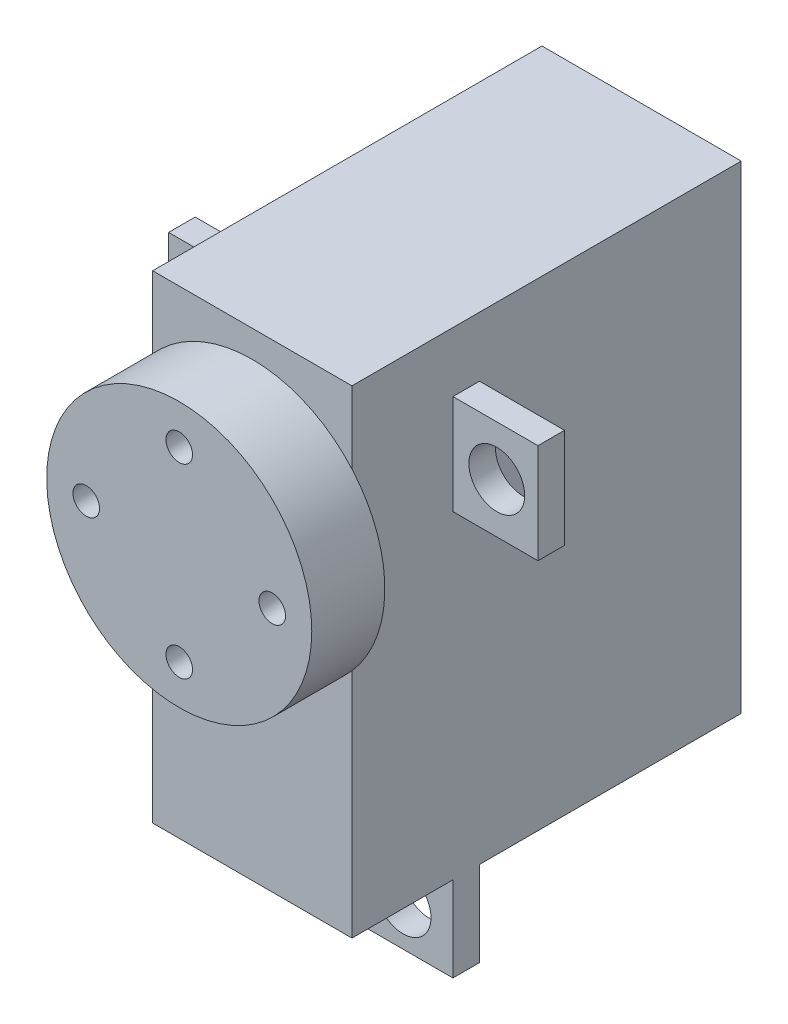
ISO-10303-21;
HEADER;
FILE_DESCRIPTION(('STEP AP214'),'2;1');
FILE_NAME('part.step','',(''),(''),'','','');
FILE_SCHEMA(('AUTOMOTIVE_DESIGN { 1 0 10303 214 1 1 1 1 }'));
ENDSEC;
DATA;
#1=APPLICATION_CONTEXT('core data for automotive mechanical design processes');
#2=APPLICATION_PROTOCOL_DEFINITION('international standard','automotive_design',2000,#1);
#3=PRODUCT_CONTEXT('',#1,'mechanical');
#4=PRODUCT('Part','Part','',(#3));
#5=PRODUCT_RELATED_PRODUCT_CATEGORY('part','',(#4));
#6=PRODUCT_DEFINITION_FORMATION('','',#4);
#7=PRODUCT_DEFINITION_CONTEXT('part definition',#1,'design');
#8=PRODUCT_DEFINITION('design','',#6,#7);
#9=PRODUCT_DEFINITION_SHAPE('','',#8);
#10=(LENGTH_UNIT() NAMED_UNIT(*) SI_UNIT(.MILLI.,.METRE.));
#11=(NAMED_UNIT(*) PLANE_ANGLE_UNIT() SI_UNIT($,.RADIAN.));
#12=(NAMED_UNIT(*) SI_UNIT($,.STERADIAN.) SOLID_ANGLE_UNIT());
#13=UNCERTAINTY_MEASURE_WITH_UNIT(LENGTH_MEASURE(1.E-05),#10,'distance_accuracy_value','');
#14=(GEOMETRIC_REPRESENTATION_CONTEXT(3) GLOBAL_UNCERTAINTY_ASSIGNED_CONTEXT((#13)) GLOBAL_UNIT_ASSIGNED_CONTEXT((#10,
#11,#12)) REPRESENTATION_CONTEXT('',''));
#15=CARTESIAN_POINT('',(0.,0.,0.));
#16=DIRECTION('',(0.,0.,1.));
#17=DIRECTION('',(1.,0.,0.));
#18=AXIS2_PLACEMENT_3D('',#15,#16,#17);
#19=CARTESIAN_POINT('',(-7.5,-18.,29.3));
#20=DIRECTION('',(0.,1.,0.));
#21=DIRECTION('',(0.,0.,1.));
#22=AXIS2_PLACEMENT_3D('',#19,#20,#21);
#23=PLANE('',#22);
#24=DIRECTION('',(0.,0.,-1.));
#25=VECTOR('',#24,1.);
#26=CARTESIAN_POINT('',(-3.,-18.,0.));
#27=LINE('',#26,#25);
#28=CARTESIAN_POINT('',(-3.,-18.,5.));
#29=VERTEX_POINT('',#28);
#30=CARTESIAN_POINT('',(-3.,-18.,0.));
#31=VERTEX_POINT('',#30);
#32=EDGE_CURVE('E58',#29,#31,#27,.T.);
#33=ORIENTED_EDGE('',*,*,#32,.F.);
#34=DIRECTION('',(-1.,0.,0.));
#35=VECTOR('',#34,1.);
#36=CARTESIAN_POINT('',(-3.,-18.,5.));
#37=LINE('',#36,#35);
#38=CARTESIAN_POINT('',(3.,-18.,5.));
#39=VERTEX_POINT('',#38);
#40=EDGE_CURVE('E62',#39,#29,#37,.T.);
#41=ORIENTED_EDGE('',*,*,#40,.F.);
#42=DIRECTION('',(0.,0.,1.));
#43=VECTOR('',#42,1.);
#44=CARTESIAN_POINT('',(3.,-18.,0.));
#45=LINE('',#44,#43);
#46=CARTESIAN_POINT('',(3.,-18.,0.));
#47=VERTEX_POINT('',#46);
#48=EDGE_CURVE('E716',#47,#39,#45,.T.);
#49=ORIENTED_EDGE('',*,*,#48,.F.);
#50=DIRECTION('',(1.,0.,0.));
#51=VECTOR('',#50,1.);
#52=CARTESIAN_POINT('',(-7.5,-18.,0.));
#53=LINE('',#52,#51);
#54=CARTESIAN_POINT('',(7.5,-18.,0.));
#55=VERTEX_POINT('',#54);
#56=EDGE_CURVE('E399',#47,#55,#53,.T.);
#57=ORIENTED_EDGE('',*,*,#56,.T.);
#58=DIRECTION('',(0.,0.,-1.));
#59=VECTOR('',#58,1.);
#60=CARTESIAN_POINT('',(7.5,-18.,29.3));
#61=LINE('',#60,#59);
#62=CARTESIAN_POINT('',(7.5,-18.,19.7));
#63=VERTEX_POINT('',#62);
#64=EDGE_CURVE('E391',#63,#55,#61,.T.);
#65=ORIENTED_EDGE('',*,*,#64,.F.);
#66=DIRECTION('',(1.,0.,0.));
#67=VECTOR('',#66,1.);
#68=CARTESIAN_POINT('',(7.5,-18.,19.7));
#69=LINE('',#68,#67);
#70=CARTESIAN_POINT('',(-7.5,-18.,19.7));
#71=VERTEX_POINT('',#70);
#72=EDGE_CURVE('E325',#71,#63,#69,.T.);
#73=ORIENTED_EDGE('',*,*,#72,.F.);
#74=DIRECTION('',(0.,0.,-1.));
#75=VECTOR('',#74,1.);
#76=CARTESIAN_POINT('',(-7.5,-18.,29.3));
#77=LINE('',#76,#75);
#78=CARTESIAN_POINT('',(-7.5,-18.,0.));
#79=VERTEX_POINT('',#78);
#80=EDGE_CURVE('E405',#71,#79,#77,.T.);
#81=ORIENTED_EDGE('',*,*,#80,.T.);
#82=EDGE_CURVE('E400',#79,#31,#53,.T.);
#83=ORIENTED_EDGE('',*,*,#82,.T.);
#84=EDGE_LOOP('',(#33,#41,#49,#57,#65,#73,#81,#83));
#85=FACE_BOUND('',#84,.T.);
#86=ADVANCED_FACE('F39',(#85),#23,.F.);
#87=CARTESIAN_POINT('',(-7.5,18.,29.3));
#88=DIRECTION('',(1.,0.,0.));
#89=DIRECTION('',(0.,1.,0.));
#90=AXIS2_PLACEMENT_3D('',#87,#88,#89);
#91=PLANE('',#90);
#92=DIRECTION('',(0.,-1.,0.));
#93=VECTOR('',#92,1.);
#94=CARTESIAN_POINT('',(-7.5,18.,0.));
#95=LINE('',#94,#93);
#96=CARTESIAN_POINT('',(-7.5,18.,0.));
#97=VERTEX_POINT('',#96);
#98=EDGE_CURVE('E396',#97,#79,#95,.T.);
#99=ORIENTED_EDGE('',*,*,#98,.T.);
#100=ORIENTED_EDGE('',*,*,#80,.F.);
#101=DIRECTION('',(0.,1.,0.));
#102=VECTOR('',#101,1.);
#103=CARTESIAN_POINT('',(-7.5,-18.,19.7));
#104=LINE('',#103,#102);
#105=CARTESIAN_POINT('',(-7.5,-24.4,19.7));
#106=VERTEX_POINT('',#105);
#107=EDGE_CURVE('E339',#106,#71,#104,.T.);
#108=ORIENTED_EDGE('',*,*,#107,.F.);
#109=DIRECTION('',(0.,0.,-1.));
#110=VECTOR('',#109,1.);
#111=CARTESIAN_POINT('',(-7.5,-24.4,21.7));
#112=LINE('',#111,#110);
#113=CARTESIAN_POINT('',(-7.5,-24.4,21.7));
#114=VERTEX_POINT('',#113);
#115=EDGE_CURVE('E343',#114,#106,#112,.T.);
#116=ORIENTED_EDGE('',*,*,#115,.F.);
#117=DIRECTION('',(0.,1.,0.));
#118=VECTOR('',#117,1.);
#119=CARTESIAN_POINT('',(-7.5,-18.,21.7));
#120=LINE('',#119,#118);
#121=CARTESIAN_POINT('',(-7.5,-18.,21.7));
#122=VERTEX_POINT('',#121);
#123=EDGE_CURVE('E328',#114,#122,#120,.T.);
#124=ORIENTED_EDGE('',*,*,#123,.T.);
#125=CARTESIAN_POINT('',(-7.5,-18.,29.3));
#126=VERTEX_POINT('',#125);
#127=EDGE_CURVE('E406',#126,#122,#77,.T.);
#128=ORIENTED_EDGE('',*,*,#127,.F.);
#129=DIRECTION('',(0.,-1.,0.));
#130=VECTOR('',#129,1.);
#131=CARTESIAN_POINT('',(-7.5,18.,29.3));
#132=LINE('',#131,#130);
#133=CARTESIAN_POINT('',(-7.5,-0.576520736681362,29.3));
#134=VERTEX_POINT('',#133);
#135=EDGE_CURVE('E384',#134,#126,#132,.T.);
#136=ORIENTED_EDGE('',*,*,#135,.F.);
#137=CARTESIAN_POINT('',(-7.5,5.13397459621556,29.3));
#138=VERTEX_POINT('',#137);
#139=EDGE_CURVE('E431',#138,#134,#132,.T.);
#140=ORIENTED_EDGE('',*,*,#139,.F.);
#141=CARTESIAN_POINT('',(-7.5,6.86602540378444,29.3));
#142=VERTEX_POINT('',#141);
#143=EDGE_CURVE('E423',#142,#138,#132,.T.);
#144=ORIENTED_EDGE('',*,*,#143,.F.);
#145=CARTESIAN_POINT('',(-7.5,12.5765207366814,29.3));
#146=VERTEX_POINT('',#145);
#147=EDGE_CURVE('E389',#146,#142,#132,.T.);
#148=ORIENTED_EDGE('',*,*,#147,.F.);
#149=CARTESIAN_POINT('',(-7.5,18.,29.3));
#150=VERTEX_POINT('',#149);
#151=EDGE_CURVE('E385',#150,#146,#132,.T.);
#152=ORIENTED_EDGE('',*,*,#151,.F.);
#153=DIRECTION('',(0.,0.,-1.));
#154=VECTOR('',#153,1.);
#155=CARTESIAN_POINT('',(-7.5,18.,29.3));
#156=LINE('',#155,#154);
#157=EDGE_CURVE('E408',#150,#97,#156,.T.);
#158=ORIENTED_EDGE('',*,*,#157,.T.);
#159=EDGE_LOOP('',(#99,#100,#108,#116,#124,#128,#136,#140,#144,#148,#152,#158));
#160=FACE_BOUND('',#159,.T.);
#161=DIRECTION('',(0.,-1.,0.));
#162=VECTOR('',#161,1.);
#163=CARTESIAN_POINT('',(-7.5,13.5,21.7));
#164=LINE('',#163,#162);
#165=CARTESIAN_POINT('',(-7.5,13.5,21.7));
#166=VERTEX_POINT('',#165);
#167=CARTESIAN_POINT('',(-7.5,6.00000000000001,21.7));
#168=VERTEX_POINT('',#167);
#169=EDGE_CURVE('E245',#166,#168,#164,.T.);
#170=ORIENTED_EDGE('',*,*,#169,.T.);
#171=DIRECTION('',(0.,0.,-1.));
#172=VECTOR('',#171,1.);
#173=CARTESIAN_POINT('',(-7.5,6.00000000000001,21.7));
#174=LINE('',#173,#172);
#175=CARTESIAN_POINT('',(-7.5,6.00000000000001,19.7));
#176=VERTEX_POINT('',#175);
#177=EDGE_CURVE('E235',#168,#176,#174,.T.);
#178=ORIENTED_EDGE('',*,*,#177,.T.);
#179=DIRECTION('',(0.,-1.,0.));
#180=VECTOR('',#179,1.);
#181=CARTESIAN_POINT('',(-7.5,13.5,19.7));
#182=LINE('',#181,#180);
#183=CARTESIAN_POINT('',(-7.5,13.5,19.7));
#184=VERTEX_POINT('',#183);
#185=EDGE_CURVE('E251',#184,#176,#182,.T.);
#186=ORIENTED_EDGE('',*,*,#185,.F.);
#187=DIRECTION('',(0.,0.,-1.));
#188=VECTOR('',#187,1.);
#189=CARTESIAN_POINT('',(-7.5,13.5,21.7));
#190=LINE('',#189,#188);
#191=EDGE_CURVE('E226',#166,#184,#190,.T.);
#192=ORIENTED_EDGE('',*,*,#191,.F.);
#193=EDGE_LOOP('',(#170,#178,#186,#192));
#194=FACE_BOUND('',#193,.T.);
#195=ADVANCED_FACE('F427',(#160,#194),#91,.F.);
#196=CARTESIAN_POINT('',(0.,0.,29.3));
#197=DIRECTION('',(0.,0.,1.));
#198=DIRECTION('',(1.,0.,0.));
#199=AXIS2_PLACEMENT_3D('',#196,#197,#198);
#200=PLANE('',#199);
#201=CARTESIAN_POINT('',(0.,6.,29.3));
#202=DIRECTION('',(0.,0.,1.));
#203=DIRECTION('',(1.,0.,0.));
#204=AXIS2_PLACEMENT_3D('',#201,#202,#203);
#205=CIRCLE('',#204,9.975);
#206=CARTESIAN_POINT('',(7.5,12.5765207366814,29.3));
#207=VERTEX_POINT('',#206);
#208=EDGE_CURVE('E50',#207,#146,#205,.T.);
#209=ORIENTED_EDGE('',*,*,#208,.F.);
#210=DIRECTION('',(0.,1.,0.));
#211=VECTOR('',#210,1.);
#212=CARTESIAN_POINT('',(7.5,18.,29.3));
#213=LINE('',#212,#211);
#214=CARTESIAN_POINT('',(7.5,18.,29.3));
#215=VERTEX_POINT('',#214);
#216=EDGE_CURVE('E382',#207,#215,#213,.T.);
#217=ORIENTED_EDGE('',*,*,#216,.T.);
#218=DIRECTION('',(-1.,0.,0.));
#219=VECTOR('',#218,1.);
#220=CARTESIAN_POINT('',(-7.5,18.,29.3));
#221=LINE('',#220,#219);
#222=EDGE_CURVE('E380',#215,#150,#221,.T.);
#223=ORIENTED_EDGE('',*,*,#222,.T.);
#224=ORIENTED_EDGE('',*,*,#151,.T.);
#225=EDGE_LOOP('',(#209,#217,#223,#224));
#226=FACE_BOUND('',#225,.T.);
#227=ADVANCED_FACE('F459',(#226),#200,.T.);
#228=CARTESIAN_POINT('',(7.5,5.13397459621556,29.3));
#229=VERTEX_POINT('',#228);
#230=CARTESIAN_POINT('',(7.5,6.86602540378444,29.3));
#231=VERTEX_POINT('',#230);
#232=EDGE_CURVE('E450',#229,#231,#213,.T.);
#233=ORIENTED_EDGE('',*,*,#232,.T.);
#234=CARTESIAN_POINT('',(7.,6.,29.3));
#235=DIRECTION('',(0.,0.,1.));
#236=DIRECTION('',(1.,0.,0.));
#237=AXIS2_PLACEMENT_3D('',#234,#235,#236);
#238=CIRCLE('',#237,1.);
#239=EDGE_CURVE('E363',#231,#229,#238,.T.);
#240=ORIENTED_EDGE('',*,*,#239,.T.);
#241=EDGE_LOOP('',(#233,#240));
#242=FACE_BOUND('',#241,.T.);
#243=ADVANCED_FACE('F511',(#242),#200,.T.);
#244=ORIENTED_EDGE('',*,*,#143,.T.);
#245=CARTESIAN_POINT('',(-7.,6.,29.3));
#246=DIRECTION('',(0.,0.,1.));
#247=DIRECTION('',(1.,0.,0.));
#248=AXIS2_PLACEMENT_3D('',#245,#246,#247);
#249=CIRCLE('',#248,1.);
#250=EDGE_CURVE('E48',#138,#142,#249,.T.);
#251=ORIENTED_EDGE('',*,*,#250,.T.);
#252=EDGE_LOOP('',(#244,#251));
#253=FACE_BOUND('',#252,.T.);
#254=ADVANCED_FACE('F422',(#253),#200,.T.);
#255=CARTESIAN_POINT('',(7.5,18.,29.3));
#256=DIRECTION('',(-1.,0.,0.));
#257=DIRECTION('',(0.,-1.,0.));
#258=AXIS2_PLACEMENT_3D('',#255,#256,#257);
#259=PLANE('',#258);
#260=DIRECTION('',(0.,0.,-1.));
#261=VECTOR('',#260,1.);
#262=CARTESIAN_POINT('',(7.5,6.,21.7));
#263=LINE('',#262,#261);
#264=CARTESIAN_POINT('',(7.5,6.,21.7));
#265=VERTEX_POINT('',#264);
#266=CARTESIAN_POINT('',(7.5,6.,19.7));
#267=VERTEX_POINT('',#266);
#268=EDGE_CURVE('E268',#265,#267,#263,.T.);
#269=ORIENTED_EDGE('',*,*,#268,.F.);
#270=DIRECTION('',(0.,1.,0.));
#271=VECTOR('',#270,1.);
#272=CARTESIAN_POINT('',(7.5,13.5,21.7));
#273=LINE('',#272,#271);
#274=CARTESIAN_POINT('',(7.5,13.5,21.7));
#275=VERTEX_POINT('',#274);
#276=EDGE_CURVE('E284',#265,#275,#273,.T.);
#277=ORIENTED_EDGE('',*,*,#276,.T.);
#278=DIRECTION('',(0.,0.,-1.));
#279=VECTOR('',#278,1.);
#280=CARTESIAN_POINT('',(7.5,13.5,21.7));
#281=LINE('',#280,#279);
#282=CARTESIAN_POINT('',(7.5,13.5,19.7));
#283=VERTEX_POINT('',#282);
#284=EDGE_CURVE('E271',#275,#283,#281,.T.);
#285=ORIENTED_EDGE('',*,*,#284,.T.);
#286=DIRECTION('',(0.,1.,0.));
#287=VECTOR('',#286,1.);
#288=CARTESIAN_POINT('',(7.5,13.5,19.7));
#289=LINE('',#288,#287);
#290=EDGE_CURVE('E290',#267,#283,#289,.T.);
#291=ORIENTED_EDGE('',*,*,#290,.F.);
#292=EDGE_LOOP('',(#269,#277,#285,#291));
#293=FACE_BOUND('',#292,.T.);
#294=DIRECTION('',(0.,1.,0.));
#295=VECTOR('',#294,1.);
#296=CARTESIAN_POINT('',(7.5,18.,0.));
#297=LINE('',#296,#295);
#298=CARTESIAN_POINT('',(7.5,18.,0.));
#299=VERTEX_POINT('',#298);
#300=EDGE_CURVE('E374',#55,#299,#297,.T.);
#301=ORIENTED_EDGE('',*,*,#300,.T.);
#302=DIRECTION('',(0.,0.,-1.));
#303=VECTOR('',#302,1.);
#304=CARTESIAN_POINT('',(7.5,18.,29.3));
#305=LINE('',#304,#303);
#306=EDGE_CURVE('E43',#215,#299,#305,.T.);
#307=ORIENTED_EDGE('',*,*,#306,.F.);
#308=ORIENTED_EDGE('',*,*,#216,.F.);
#309=EDGE_CURVE('E453',#231,#207,#213,.T.);
#310=ORIENTED_EDGE('',*,*,#309,.F.);
#311=ORIENTED_EDGE('',*,*,#232,.F.);
#312=CARTESIAN_POINT('',(7.5,-0.576520736681362,29.3));
#313=VERTEX_POINT('',#312);
#314=EDGE_CURVE('E381',#313,#229,#213,.T.);
#315=ORIENTED_EDGE('',*,*,#314,.F.);
#316=CARTESIAN_POINT('',(7.5,-18.,29.3));
#317=VERTEX_POINT('',#316);
#318=EDGE_CURVE('E377',#317,#313,#213,.T.);
#319=ORIENTED_EDGE('',*,*,#318,.F.);
#320=CARTESIAN_POINT('',(7.5,-18.,21.7));
#321=VERTEX_POINT('',#320);
#322=EDGE_CURVE('E402',#317,#321,#61,.T.);
#323=ORIENTED_EDGE('',*,*,#322,.T.);
#324=DIRECTION('',(0.,-1.,0.));
#325=VECTOR('',#324,1.);
#326=CARTESIAN_POINT('',(7.5,-18.,21.7));
#327=LINE('',#326,#325);
#328=CARTESIAN_POINT('',(7.5,-24.4,21.7));
#329=VERTEX_POINT('',#328);
#330=EDGE_CURVE('E321',#321,#329,#327,.T.);
#331=ORIENTED_EDGE('',*,*,#330,.T.);
#332=DIRECTION('',(0.,0.,-1.));
#333=VECTOR('',#332,1.);
#334=CARTESIAN_POINT('',(7.5,-24.4,21.7));
#335=LINE('',#334,#333);
#336=CARTESIAN_POINT('',(7.5,-24.4,19.7));
#337=VERTEX_POINT('',#336);
#338=EDGE_CURVE('E333',#329,#337,#335,.T.);
#339=ORIENTED_EDGE('',*,*,#338,.T.);
#340=DIRECTION('',(0.,-1.,0.));
#341=VECTOR('',#340,1.);
#342=CARTESIAN_POINT('',(7.5,-18.,19.7));
#343=LINE('',#342,#341);
#344=EDGE_CURVE('E318',#63,#337,#343,.T.);
#345=ORIENTED_EDGE('',*,*,#344,.F.);
#346=ORIENTED_EDGE('',*,*,#64,.T.);
#347=EDGE_LOOP('',(#301,#307,#308,#310,#311,#315,#319,#323,#331,#339,#345,#346));
#348=FACE_BOUND('',#347,.T.);
#349=ADVANCED_FACE('F41',(#293,#348),#259,.F.);
#350=CARTESIAN_POINT('',(-7.5,18.,29.3));
#351=DIRECTION('',(0.,-1.,0.));
#352=DIRECTION('',(0.,0.,-1.));
#353=AXIS2_PLACEMENT_3D('',#350,#351,#352);
#354=PLANE('',#353);
#355=DIRECTION('',(-1.,0.,0.));
#356=VECTOR('',#355,1.);
#357=CARTESIAN_POINT('',(-7.5,18.,0.));
#358=LINE('',#357,#356);
#359=EDGE_CURVE('E394',#299,#97,#358,.T.);
#360=ORIENTED_EDGE('',*,*,#359,.T.);
#361=ORIENTED_EDGE('',*,*,#157,.F.);
#362=ORIENTED_EDGE('',*,*,#222,.F.);
#363=ORIENTED_EDGE('',*,*,#306,.T.);
#364=EDGE_LOOP('',(#360,#361,#362,#363));
#365=FACE_BOUND('',#364,.T.);
#366=ADVANCED_FACE('F460',(#365),#354,.F.);
#367=ORIENTED_EDGE('',*,*,#127,.T.);
#368=DIRECTION('',(1.,0.,0.));
#369=VECTOR('',#368,1.);
#370=CARTESIAN_POINT('',(7.5,-18.,21.7));
#371=LINE('',#370,#369);
#372=EDGE_CURVE('E330',#122,#321,#371,.T.);
#373=ORIENTED_EDGE('',*,*,#372,.T.);
#374=ORIENTED_EDGE('',*,*,#322,.F.);
#375=DIRECTION('',(1.,0.,0.));
#376=VECTOR('',#375,1.);
#377=CARTESIAN_POINT('',(-7.5,-18.,29.3));
#378=LINE('',#377,#376);
#379=EDGE_CURVE('E388',#126,#317,#378,.T.);
#380=ORIENTED_EDGE('',*,*,#379,.F.);
#381=EDGE_LOOP('',(#367,#373,#374,#380));
#382=FACE_BOUND('',#381,.T.);
#383=ADVANCED_FACE('F443',(#382),#23,.F.);
#384=EDGE_CURVE('E11',#134,#313,#205,.T.);
#385=ORIENTED_EDGE('',*,*,#384,.F.);
#386=ORIENTED_EDGE('',*,*,#135,.T.);
#387=ORIENTED_EDGE('',*,*,#379,.T.);
#388=ORIENTED_EDGE('',*,*,#318,.T.);
#389=EDGE_LOOP('',(#385,#386,#387,#388));
#390=FACE_BOUND('',#389,.T.);
#391=ADVANCED_FACE('F437',(#390),#200,.T.);
#392=CARTESIAN_POINT('',(0.,0.,0.));
#393=DIRECTION('',(0.,0.,1.));
#394=DIRECTION('',(1.,0.,0.));
#395=AXIS2_PLACEMENT_3D('',#392,#393,#394);
#396=PLANE('',#395);
#397=ORIENTED_EDGE('',*,*,#300,.F.);
#398=ORIENTED_EDGE('',*,*,#56,.F.);
#399=DIRECTION('',(0.,1.,0.));
#400=VECTOR('',#399,1.);
#401=CARTESIAN_POINT('',(3.,-22.,0.));
#402=LINE('',#401,#400);
#403=CARTESIAN_POINT('',(3.,-22.,0.));
#404=VERTEX_POINT('',#403);
#405=EDGE_CURVE('E211',#404,#47,#402,.T.);
#406=ORIENTED_EDGE('',*,*,#405,.F.);
#407=DIRECTION('',(1.,0.,0.));
#408=VECTOR('',#407,1.);
#409=CARTESIAN_POINT('',(-3.,-22.,0.));
#410=LINE('',#409,#408);
#411=CARTESIAN_POINT('',(-3.,-22.,0.));
#412=VERTEX_POINT('',#411);
#413=EDGE_CURVE('E203',#412,#404,#410,.T.);
#414=ORIENTED_EDGE('',*,*,#413,.F.);
#415=DIRECTION('',(0.,1.,0.));
#416=VECTOR('',#415,1.);
#417=CARTESIAN_POINT('',(-3.,-22.,0.));
#418=LINE('',#417,#416);
#419=EDGE_CURVE('E209',#412,#31,#418,.T.);
#420=ORIENTED_EDGE('',*,*,#419,.T.);
#421=ORIENTED_EDGE('',*,*,#82,.F.);
#422=ORIENTED_EDGE('',*,*,#98,.F.);
#423=ORIENTED_EDGE('',*,*,#359,.F.);
#424=EDGE_LOOP('',(#397,#398,#406,#414,#420,#421,#422,#423));
#425=FACE_BOUND('',#424,.T.);
#426=ADVANCED_FACE('F206',(#425),#396,.F.);
#427=CARTESIAN_POINT('',(0.,6.,29.3));
#428=DIRECTION('',(0.,0.,1.));
#429=DIRECTION('',(1.,0.,0.));
#430=AXIS2_PLACEMENT_3D('',#427,#428,#429);
#431=PLANE('',#430);
#432=EDGE_CURVE('E369',#313,#207,#205,.T.);
#433=ORIENTED_EDGE('',*,*,#432,.F.);
#434=ORIENTED_EDGE('',*,*,#314,.T.);
#435=EDGE_CURVE('E356',#229,#231,#238,.T.);
#436=ORIENTED_EDGE('',*,*,#435,.T.);
#437=ORIENTED_EDGE('',*,*,#309,.T.);
#438=EDGE_LOOP('',(#433,#434,#436,#437));
#439=FACE_BOUND('',#438,.T.);
#440=ADVANCED_FACE('F672',(#439),#431,.F.);
#441=EDGE_CURVE('E51',#146,#134,#205,.T.);
#442=ORIENTED_EDGE('',*,*,#441,.F.);
#443=ORIENTED_EDGE('',*,*,#147,.T.);
#444=EDGE_CURVE('E345',#142,#138,#249,.T.);
#445=ORIENTED_EDGE('',*,*,#444,.T.);
#446=ORIENTED_EDGE('',*,*,#139,.T.);
#447=EDGE_LOOP('',(#442,#443,#445,#446));
#448=FACE_BOUND('',#447,.T.);
#449=ADVANCED_FACE('F763',(#448),#431,.F.);
#450=CARTESIAN_POINT('',(0.,6.,34.8));
#451=DIRECTION('',(0.,0.,1.));
#452=DIRECTION('',(1.,0.,0.));
#453=AXIS2_PLACEMENT_3D('',#450,#451,#452);
#454=PLANE('',#453);
#455=CARTESIAN_POINT('',(0.,-0.999999999999998,34.8));
#456=DIRECTION('',(0.,0.,1.));
#457=DIRECTION('',(1.,0.,0.));
#458=AXIS2_PLACEMENT_3D('',#455,#456,#457);
#459=CIRCLE('',#458,1.);
#460=CARTESIAN_POINT('',(1.,-0.999999999999998,34.8));
#461=VERTEX_POINT('',#460);
#462=EDGE_CURVE('E353',#461,#461,#459,.T.);
#463=ORIENTED_EDGE('',*,*,#462,.F.);
#464=EDGE_LOOP('',(#463));
#465=FACE_BOUND('',#464,.T.);
#466=CARTESIAN_POINT('',(0.,13.,34.8));
#467=DIRECTION('',(0.,0.,1.));
#468=DIRECTION('',(1.,0.,0.));
#469=AXIS2_PLACEMENT_3D('',#466,#467,#468);
#470=CIRCLE('',#469,1.);
#471=CARTESIAN_POINT('',(1.,13.,34.8));
#472=VERTEX_POINT('',#471);
#473=EDGE_CURVE('E366',#472,#472,#470,.T.);
#474=ORIENTED_EDGE('',*,*,#473,.F.);
#475=EDGE_LOOP('',(#474));
#476=FACE_BOUND('',#475,.T.);
#477=CARTESIAN_POINT('',(0.,6.,34.8));
#478=DIRECTION('',(0.,0.,1.));
#479=DIRECTION('',(1.,0.,0.));
#480=AXIS2_PLACEMENT_3D('',#477,#478,#479);
#481=CIRCLE('',#480,9.975);
#482=CARTESIAN_POINT('',(9.975,6.,34.8));
#483=VERTEX_POINT('',#482);
#484=EDGE_CURVE('E372',#483,#483,#481,.T.);
#485=ORIENTED_EDGE('',*,*,#484,.T.);
#486=EDGE_LOOP('',(#485));
#487=FACE_BOUND('',#486,.T.);
#488=CARTESIAN_POINT('',(7.,6.,34.8));
#489=DIRECTION('',(0.,0.,1.));
#490=DIRECTION('',(1.,0.,0.));
#491=AXIS2_PLACEMENT_3D('',#488,#489,#490);
#492=CIRCLE('',#491,1.);
#493=CARTESIAN_POINT('',(8.,6.,34.8));
#494=VERTEX_POINT('',#493);
#495=EDGE_CURVE('E359',#494,#494,#492,.T.);
#496=ORIENTED_EDGE('',*,*,#495,.F.);
#497=EDGE_LOOP('',(#496));
#498=FACE_BOUND('',#497,.T.);
#499=CARTESIAN_POINT('',(-7.,6.,34.8));
#500=DIRECTION('',(0.,0.,1.));
#501=DIRECTION('',(1.,0.,0.));
#502=AXIS2_PLACEMENT_3D('',#499,#500,#501);
#503=CIRCLE('',#502,1.);
#504=CARTESIAN_POINT('',(-6.,6.,34.8));
#505=VERTEX_POINT('',#504);
#506=EDGE_CURVE('E347',#505,#505,#503,.T.);
#507=ORIENTED_EDGE('',*,*,#506,.F.);
#508=EDGE_LOOP('',(#507));
#509=FACE_BOUND('',#508,.T.);
#510=ADVANCED_FACE('F772',(#465,#476,#487,#498,#509),#454,.T.);
#511=CARTESIAN_POINT('',(0.,6.,34.8));
#512=DIRECTION('',(0.,0.,-1.));
#513=DIRECTION('',(-1.,0.,0.));
#514=AXIS2_PLACEMENT_3D('',#511,#512,#513);
#515=CYLINDRICAL_SURFACE('',#514,9.975);
#516=ORIENTED_EDGE('',*,*,#484,.F.);
#517=EDGE_LOOP('',(#516));
#518=FACE_BOUND('',#517,.T.);
#519=ORIENTED_EDGE('',*,*,#208,.T.);
#520=ORIENTED_EDGE('',*,*,#441,.T.);
#521=ORIENTED_EDGE('',*,*,#384,.T.);
#522=ORIENTED_EDGE('',*,*,#432,.T.);
#523=EDGE_LOOP('',(#519,#520,#521,#522));
#524=FACE_BOUND('',#523,.T.);
#525=ADVANCED_FACE('F780',(#518,#524),#515,.T.);
#526=CARTESIAN_POINT('',(0.,13.,34.8));
#527=DIRECTION('',(0.,0.,-1.));
#528=DIRECTION('',(-1.,0.,0.));
#529=AXIS2_PLACEMENT_3D('',#526,#527,#528);
#530=CYLINDRICAL_SURFACE('',#529,1.);
#531=ORIENTED_EDGE('',*,*,#473,.T.);
#532=EDGE_LOOP('',(#531));
#533=FACE_BOUND('',#532,.T.);
#534=CARTESIAN_POINT('',(0.,13.,29.3));
#535=DIRECTION('',(0.,0.,1.));
#536=DIRECTION('',(1.,0.,0.));
#537=AXIS2_PLACEMENT_3D('',#534,#535,#536);
#538=CIRCLE('',#537,1.);
#539=CARTESIAN_POINT('',(1.,13.,29.3));
#540=VERTEX_POINT('',#539);
#541=EDGE_CURVE('E362',#540,#540,#538,.T.);
#542=ORIENTED_EDGE('',*,*,#541,.F.);
#543=EDGE_LOOP('',(#542));
#544=FACE_BOUND('',#543,.T.);
#545=ADVANCED_FACE('F790',(#533,#544),#530,.F.);
#546=CARTESIAN_POINT('',(7.,6.,34.8));
#547=DIRECTION('',(0.,0.,-1.));
#548=DIRECTION('',(-1.,0.,0.));
#549=AXIS2_PLACEMENT_3D('',#546,#547,#548);
#550=CYLINDRICAL_SURFACE('',#549,1.);
#551=ORIENTED_EDGE('',*,*,#495,.T.);
#552=EDGE_LOOP('',(#551));
#553=FACE_BOUND('',#552,.T.);
#554=ORIENTED_EDGE('',*,*,#239,.F.);
#555=ORIENTED_EDGE('',*,*,#435,.F.);
#556=EDGE_LOOP('',(#554,#555));
#557=FACE_BOUND('',#556,.T.);
#558=ADVANCED_FACE('F800',(#553,#557),#550,.F.);
#559=CARTESIAN_POINT('',(0.,-0.999999999999998,34.8));
#560=DIRECTION('',(0.,0.,-1.));
#561=DIRECTION('',(-1.,0.,0.));
#562=AXIS2_PLACEMENT_3D('',#559,#560,#561);
#563=CYLINDRICAL_SURFACE('',#562,1.);
#564=ORIENTED_EDGE('',*,*,#462,.T.);
#565=EDGE_LOOP('',(#564));
#566=FACE_BOUND('',#565,.T.);
#567=CARTESIAN_POINT('',(0.,-0.999999999999998,29.3));
#568=DIRECTION('',(0.,0.,1.));
#569=DIRECTION('',(1.,0.,0.));
#570=AXIS2_PLACEMENT_3D('',#567,#568,#569);
#571=CIRCLE('',#570,1.);
#572=CARTESIAN_POINT('',(1.,-0.999999999999998,29.3));
#573=VERTEX_POINT('',#572);
#574=EDGE_CURVE('E350',#573,#573,#571,.T.);
#575=ORIENTED_EDGE('',*,*,#574,.F.);
#576=EDGE_LOOP('',(#575));
#577=FACE_BOUND('',#576,.T.);
#578=ADVANCED_FACE('F810',(#566,#577),#563,.F.);
#579=CARTESIAN_POINT('',(-7.,6.,34.8));
#580=DIRECTION('',(0.,0.,-1.));
#581=DIRECTION('',(-1.,0.,0.));
#582=AXIS2_PLACEMENT_3D('',#579,#580,#581);
#583=CYLINDRICAL_SURFACE('',#582,1.);
#584=ORIENTED_EDGE('',*,*,#506,.T.);
#585=EDGE_LOOP('',(#584));
#586=FACE_BOUND('',#585,.T.);
#587=ORIENTED_EDGE('',*,*,#444,.F.);
#588=ORIENTED_EDGE('',*,*,#250,.F.);
#589=EDGE_LOOP('',(#587,#588));
#590=FACE_BOUND('',#589,.T.);
#591=ADVANCED_FACE('F737',(#586,#590),#583,.F.);
#592=ORIENTED_EDGE('',*,*,#574,.T.);
#593=EDGE_LOOP('',(#592));
#594=FACE_BOUND('',#593,.T.);
#595=ADVANCED_FACE('F512',(#594),#200,.T.);
#596=ORIENTED_EDGE('',*,*,#541,.T.);
#597=EDGE_LOOP('',(#596));
#598=FACE_BOUND('',#597,.T.);
#599=ADVANCED_FACE('F484',(#598),#200,.T.);
#600=CARTESIAN_POINT('',(7.5,-24.4,21.7));
#601=DIRECTION('',(0.,-1.,0.));
#602=DIRECTION('',(0.,0.,-1.));
#603=AXIS2_PLACEMENT_3D('',#600,#601,#602);
#604=PLANE('',#603);
#605=DIRECTION('',(-1.,0.,0.));
#606=VECTOR('',#605,1.);
#607=CARTESIAN_POINT('',(7.5,-24.4,19.7));
#608=LINE('',#607,#606);
#609=EDGE_CURVE('E336',#337,#106,#608,.T.);
#610=ORIENTED_EDGE('',*,*,#609,.F.);
#611=ORIENTED_EDGE('',*,*,#338,.F.);
#612=DIRECTION('',(-1.,0.,0.));
#613=VECTOR('',#612,1.);
#614=CARTESIAN_POINT('',(7.5,-24.4,21.7));
#615=LINE('',#614,#613);
#616=EDGE_CURVE('E324',#329,#114,#615,.T.);
#617=ORIENTED_EDGE('',*,*,#616,.T.);
#618=ORIENTED_EDGE('',*,*,#115,.T.);
#619=EDGE_LOOP('',(#610,#611,#617,#618));
#620=FACE_BOUND('',#619,.T.);
#621=ADVANCED_FACE('F470',(#620),#604,.T.);
#622=CARTESIAN_POINT('',(0.,0.,21.7));
#623=DIRECTION('',(0.,0.,-1.));
#624=DIRECTION('',(-1.,0.,0.));
#625=AXIS2_PLACEMENT_3D('',#622,#623,#624);
#626=PLANE('',#625);
#627=CARTESIAN_POINT('',(-3.75,-21.3,21.7));
#628=DIRECTION('',(0.,0.,-1.));
#629=DIRECTION('',(-1.,0.,0.));
#630=AXIS2_PLACEMENT_3D('',#627,#628,#629);
#631=CIRCLE('',#630,2.1);
#632=CARTESIAN_POINT('',(-5.85,-21.3,21.7));
#633=VERTEX_POINT('',#632);
#634=EDGE_CURVE('E309',#633,#633,#631,.T.);
#635=ORIENTED_EDGE('',*,*,#634,.T.);
#636=EDGE_LOOP('',(#635));
#637=FACE_BOUND('',#636,.T.);
#638=CARTESIAN_POINT('',(3.75,-21.3,21.7));
#639=DIRECTION('',(0.,0.,-1.));
#640=DIRECTION('',(-1.,0.,0.));
#641=AXIS2_PLACEMENT_3D('',#638,#639,#640);
#642=CIRCLE('',#641,2.1);
#643=CARTESIAN_POINT('',(1.65,-21.3,21.7));
#644=VERTEX_POINT('',#643);
#645=EDGE_CURVE('E315',#644,#644,#642,.T.);
#646=ORIENTED_EDGE('',*,*,#645,.T.);
#647=EDGE_LOOP('',(#646));
#648=FACE_BOUND('',#647,.T.);
#649=ORIENTED_EDGE('',*,*,#330,.F.);
#650=ORIENTED_EDGE('',*,*,#372,.F.);
#651=ORIENTED_EDGE('',*,*,#123,.F.);
#652=ORIENTED_EDGE('',*,*,#616,.F.);
#653=EDGE_LOOP('',(#649,#650,#651,#652));
#654=FACE_BOUND('',#653,.T.);
#655=ADVANCED_FACE('F473',(#637,#648,#654),#626,.F.);
#656=CARTESIAN_POINT('',(0.,0.,19.7));
#657=DIRECTION('',(0.,0.,-1.));
#658=DIRECTION('',(-1.,0.,0.));
#659=AXIS2_PLACEMENT_3D('',#656,#657,#658);
#660=PLANE('',#659);
#661=CARTESIAN_POINT('',(-3.75,-21.3,19.7));
#662=DIRECTION('',(0.,0.,-1.));
#663=DIRECTION('',(-1.,0.,0.));
#664=AXIS2_PLACEMENT_3D('',#661,#662,#663);
#665=CIRCLE('',#664,2.1);
#666=CARTESIAN_POINT('',(-5.85,-21.3,19.7));
#667=VERTEX_POINT('',#666);
#668=EDGE_CURVE('E306',#667,#667,#665,.T.);
#669=ORIENTED_EDGE('',*,*,#668,.F.);
#670=EDGE_LOOP('',(#669));
#671=FACE_BOUND('',#670,.T.);
#672=CARTESIAN_POINT('',(3.75,-21.3,19.7));
#673=DIRECTION('',(0.,0.,-1.));
#674=DIRECTION('',(-1.,0.,0.));
#675=AXIS2_PLACEMENT_3D('',#672,#673,#674);
#676=CIRCLE('',#675,2.1);
#677=CARTESIAN_POINT('',(1.65,-21.3,19.7));
#678=VERTEX_POINT('',#677);
#679=EDGE_CURVE('E312',#678,#678,#676,.T.);
#680=ORIENTED_EDGE('',*,*,#679,.F.);
#681=EDGE_LOOP('',(#680));
#682=FACE_BOUND('',#681,.T.);
#683=ORIENTED_EDGE('',*,*,#344,.T.);
#684=ORIENTED_EDGE('',*,*,#609,.T.);
#685=ORIENTED_EDGE('',*,*,#107,.T.);
#686=ORIENTED_EDGE('',*,*,#72,.T.);
#687=EDGE_LOOP('',(#683,#684,#685,#686));
#688=FACE_BOUND('',#687,.T.);
#689=ADVANCED_FACE('F467',(#671,#682,#688),#660,.T.);
#690=CARTESIAN_POINT('',(3.75,-21.3,21.7));
#691=DIRECTION('',(0.,0.,-1.));
#692=DIRECTION('',(-1.,0.,0.));
#693=AXIS2_PLACEMENT_3D('',#690,#691,#692);
#694=CYLINDRICAL_SURFACE('',#693,2.1);
#695=ORIENTED_EDGE('',*,*,#645,.F.);
#696=EDGE_LOOP('',(#695));
#697=FACE_BOUND('',#696,.T.);
#698=ORIENTED_EDGE('',*,*,#679,.T.);
#699=EDGE_LOOP('',(#698));
#700=FACE_BOUND('',#699,.T.);
#701=ADVANCED_FACE('F481',(#697,#700),#694,.F.);
#702=CARTESIAN_POINT('',(-3.75,-21.3,21.7));
#703=DIRECTION('',(0.,0.,-1.));
#704=DIRECTION('',(-1.,0.,0.));
#705=AXIS2_PLACEMENT_3D('',#702,#703,#704);
#706=CYLINDRICAL_SURFACE('',#705,2.1);
#707=ORIENTED_EDGE('',*,*,#634,.F.);
#708=EDGE_LOOP('',(#707));
#709=FACE_BOUND('',#708,.T.);
#710=ORIENTED_EDGE('',*,*,#668,.T.);
#711=EDGE_LOOP('',(#710));
#712=FACE_BOUND('',#711,.T.);
#713=ADVANCED_FACE('F548',(#709,#712),#706,.F.);
#714=CARTESIAN_POINT('',(7.5,6.,21.7));
#715=DIRECTION('',(0.,-1.,0.));
#716=DIRECTION('',(1.,0.,0.));
#717=AXIS2_PLACEMENT_3D('',#714,#715,#716);
#718=PLANE('',#717);
#719=DIRECTION('',(-1.,0.,0.));
#720=VECTOR('',#719,1.);
#721=CARTESIAN_POINT('',(7.5,6.,19.7));
#722=LINE('',#721,#720);
#723=CARTESIAN_POINT('',(13.9,6.,19.7));
#724=VERTEX_POINT('',#723);
#725=EDGE_CURVE('E280',#724,#267,#722,.T.);
#726=ORIENTED_EDGE('',*,*,#725,.F.);
#727=DIRECTION('',(0.,0.,-1.));
#728=VECTOR('',#727,1.);
#729=CARTESIAN_POINT('',(13.9,6.,21.7));
#730=LINE('',#729,#728);
#731=CARTESIAN_POINT('',(13.9,6.,21.7));
#732=VERTEX_POINT('',#731);
#733=EDGE_CURVE('E276',#732,#724,#730,.T.);
#734=ORIENTED_EDGE('',*,*,#733,.F.);
#735=DIRECTION('',(-1.,0.,0.));
#736=VECTOR('',#735,1.);
#737=CARTESIAN_POINT('',(7.5,6.,21.7));
#738=LINE('',#737,#736);
#739=EDGE_CURVE('E273',#732,#265,#738,.T.);
#740=ORIENTED_EDGE('',*,*,#739,.T.);
#741=ORIENTED_EDGE('',*,*,#268,.T.);
#742=EDGE_LOOP('',(#726,#734,#740,#741));
#743=FACE_BOUND('',#742,.T.);
#744=ADVANCED_FACE('F522',(#743),#718,.T.);
#745=CARTESIAN_POINT('',(13.9,13.5,21.7));
#746=DIRECTION('',(1.,0.,0.));
#747=DIRECTION('',(0.,1.,0.));
#748=AXIS2_PLACEMENT_3D('',#745,#746,#747);
#749=PLANE('',#748);
#750=DIRECTION('',(0.,-1.,0.));
#751=VECTOR('',#750,1.);
#752=CARTESIAN_POINT('',(13.9,13.5,19.7));
#753=LINE('',#752,#751);
#754=CARTESIAN_POINT('',(13.9,13.5,19.7));
#755=VERTEX_POINT('',#754);
#756=EDGE_CURVE('E283',#755,#724,#753,.T.);
#757=ORIENTED_EDGE('',*,*,#756,.F.);
#758=DIRECTION('',(0.,0.,-1.));
#759=VECTOR('',#758,1.);
#760=CARTESIAN_POINT('',(13.9,13.5,21.7));
#761=LINE('',#760,#759);
#762=CARTESIAN_POINT('',(13.9,13.5,21.7));
#763=VERTEX_POINT('',#762);
#764=EDGE_CURVE('E274',#763,#755,#761,.T.);
#765=ORIENTED_EDGE('',*,*,#764,.F.);
#766=DIRECTION('',(0.,-1.,0.));
#767=VECTOR('',#766,1.);
#768=CARTESIAN_POINT('',(13.9,13.5,21.7));
#769=LINE('',#768,#767);
#770=EDGE_CURVE('E296',#763,#732,#769,.T.);
#771=ORIENTED_EDGE('',*,*,#770,.T.);
#772=ORIENTED_EDGE('',*,*,#733,.T.);
#773=EDGE_LOOP('',(#757,#765,#771,#772));
#774=FACE_BOUND('',#773,.T.);
#775=ADVANCED_FACE('F525',(#774),#749,.T.);
#776=CARTESIAN_POINT('',(7.5,13.5,21.7));
#777=DIRECTION('',(0.,1.,0.));
#778=DIRECTION('',(0.,0.,1.));
#779=AXIS2_PLACEMENT_3D('',#776,#777,#778);
#780=PLANE('',#779);
#781=DIRECTION('',(1.,0.,0.));
#782=VECTOR('',#781,1.);
#783=CARTESIAN_POINT('',(7.5,13.5,19.7));
#784=LINE('',#783,#782);
#785=EDGE_CURVE('E287',#283,#755,#784,.T.);
#786=ORIENTED_EDGE('',*,*,#785,.F.);
#787=ORIENTED_EDGE('',*,*,#284,.F.);
#788=DIRECTION('',(1.,0.,0.));
#789=VECTOR('',#788,1.);
#790=CARTESIAN_POINT('',(7.5,13.5,21.7));
#791=LINE('',#790,#789);
#792=EDGE_CURVE('E299',#275,#763,#791,.T.);
#793=ORIENTED_EDGE('',*,*,#792,.T.);
#794=ORIENTED_EDGE('',*,*,#764,.T.);
#795=EDGE_LOOP('',(#786,#787,#793,#794));
#796=FACE_BOUND('',#795,.T.);
#797=ADVANCED_FACE('F528',(#796),#780,.T.);
#798=CARTESIAN_POINT('',(0.,0.,21.7));
#799=DIRECTION('',(0.,0.,1.));
#800=DIRECTION('',(1.,0.,0.));
#801=AXIS2_PLACEMENT_3D('',#798,#799,#800);
#802=PLANE('',#801);
#803=CARTESIAN_POINT('',(10.8,9.75,21.7));
#804=DIRECTION('',(0.,0.,-1.));
#805=DIRECTION('',(-1.,0.,0.));
#806=AXIS2_PLACEMENT_3D('',#803,#804,#805);
#807=CIRCLE('',#806,2.1);
#808=CARTESIAN_POINT('',(8.7,9.75,21.7));
#809=VERTEX_POINT('',#808);
#810=EDGE_CURVE('E293',#809,#809,#807,.T.);
#811=ORIENTED_EDGE('',*,*,#810,.T.);
#812=EDGE_LOOP('',(#811));
#813=FACE_BOUND('',#812,.T.);
#814=ORIENTED_EDGE('',*,*,#276,.F.);
#815=ORIENTED_EDGE('',*,*,#739,.F.);
#816=ORIENTED_EDGE('',*,*,#770,.F.);
#817=ORIENTED_EDGE('',*,*,#792,.F.);
#818=EDGE_LOOP('',(#814,#815,#816,#817));
#819=FACE_BOUND('',#818,.T.);
#820=ADVANCED_FACE('F520',(#813,#819),#802,.T.);
#821=CARTESIAN_POINT('',(0.,0.,19.7));
#822=DIRECTION('',(0.,0.,1.));
#823=DIRECTION('',(1.,0.,0.));
#824=AXIS2_PLACEMENT_3D('',#821,#822,#823);
#825=PLANE('',#824);
#826=CARTESIAN_POINT('',(10.8,9.75,19.7));
#827=DIRECTION('',(0.,0.,-1.));
#828=DIRECTION('',(-1.,0.,0.));
#829=AXIS2_PLACEMENT_3D('',#826,#827,#828);
#830=CIRCLE('',#829,2.1);
#831=CARTESIAN_POINT('',(8.7,9.75,19.7));
#832=VERTEX_POINT('',#831);
#833=EDGE_CURVE('E303',#832,#832,#830,.T.);
#834=ORIENTED_EDGE('',*,*,#833,.F.);
#835=EDGE_LOOP('',(#834));
#836=FACE_BOUND('',#835,.T.);
#837=ORIENTED_EDGE('',*,*,#290,.T.);
#838=ORIENTED_EDGE('',*,*,#785,.T.);
#839=ORIENTED_EDGE('',*,*,#756,.T.);
#840=ORIENTED_EDGE('',*,*,#725,.T.);
#841=EDGE_LOOP('',(#837,#838,#839,#840));
#842=FACE_BOUND('',#841,.T.);
#843=ADVANCED_FACE('F530',(#836,#842),#825,.F.);
#844=CARTESIAN_POINT('',(10.8,9.75,21.7));
#845=DIRECTION('',(0.,0.,-1.));
#846=DIRECTION('',(-1.,0.,0.));
#847=AXIS2_PLACEMENT_3D('',#844,#845,#846);
#848=CYLINDRICAL_SURFACE('',#847,2.1);
#849=ORIENTED_EDGE('',*,*,#810,.F.);
#850=EDGE_LOOP('',(#849));
#851=FACE_BOUND('',#850,.T.);
#852=ORIENTED_EDGE('',*,*,#833,.T.);
#853=EDGE_LOOP('',(#852));
#854=FACE_BOUND('',#853,.T.);
#855=ADVANCED_FACE('F532',(#851,#854),#848,.F.);
#856=CARTESIAN_POINT('',(-7.5,13.5,21.7));
#857=DIRECTION('',(0.,1.,0.));
#858=DIRECTION('',(0.,0.,1.));
#859=AXIS2_PLACEMENT_3D('',#856,#857,#858);
#860=PLANE('',#859);
#861=DIRECTION('',(1.,0.,0.));
#862=VECTOR('',#861,1.);
#863=CARTESIAN_POINT('',(-7.5,13.5,19.7));
#864=LINE('',#863,#862);
#865=CARTESIAN_POINT('',(-13.9,13.5,19.7));
#866=VERTEX_POINT('',#865);
#867=EDGE_CURVE('E242',#866,#184,#864,.T.);
#868=ORIENTED_EDGE('',*,*,#867,.F.);
#869=DIRECTION('',(0.,0.,-1.));
#870=VECTOR('',#869,1.);
#871=CARTESIAN_POINT('',(-13.9,13.5,21.7));
#872=LINE('',#871,#870);
#873=CARTESIAN_POINT('',(-13.9,13.5,21.7));
#874=VERTEX_POINT('',#873);
#875=EDGE_CURVE('E229',#874,#866,#872,.T.);
#876=ORIENTED_EDGE('',*,*,#875,.F.);
#877=DIRECTION('',(1.,0.,0.));
#878=VECTOR('',#877,1.);
#879=CARTESIAN_POINT('',(-7.5,13.5,21.7));
#880=LINE('',#879,#878);
#881=EDGE_CURVE('E238',#874,#166,#880,.T.);
#882=ORIENTED_EDGE('',*,*,#881,.T.);
#883=ORIENTED_EDGE('',*,*,#191,.T.);
#884=EDGE_LOOP('',(#868,#876,#882,#883));
#885=FACE_BOUND('',#884,.T.);
#886=ADVANCED_FACE('F539',(#885),#860,.T.);
#887=CARTESIAN_POINT('',(-13.9,13.5,21.7));
#888=DIRECTION('',(-1.,0.,0.));
#889=DIRECTION('',(0.,-1.,0.));
#890=AXIS2_PLACEMENT_3D('',#887,#888,#889);
#891=PLANE('',#890);
#892=DIRECTION('',(0.,1.,0.));
#893=VECTOR('',#892,1.);
#894=CARTESIAN_POINT('',(-13.9,13.5,19.7));
#895=LINE('',#894,#893);
#896=CARTESIAN_POINT('',(-13.9,6.,19.7));
#897=VERTEX_POINT('',#896);
#898=EDGE_CURVE('E244',#897,#866,#895,.T.);
#899=ORIENTED_EDGE('',*,*,#898,.F.);
#900=DIRECTION('',(0.,0.,-1.));
#901=VECTOR('',#900,1.);
#902=CARTESIAN_POINT('',(-13.9,6.,21.7));
#903=LINE('',#902,#901);
#904=CARTESIAN_POINT('',(-13.9,6.,21.7));
#905=VERTEX_POINT('',#904);
#906=EDGE_CURVE('E239',#905,#897,#903,.T.);
#907=ORIENTED_EDGE('',*,*,#906,.F.);
#908=DIRECTION('',(0.,1.,0.));
#909=VECTOR('',#908,1.);
#910=CARTESIAN_POINT('',(-13.9,13.5,21.7));
#911=LINE('',#910,#909);
#912=EDGE_CURVE('E257',#905,#874,#911,.T.);
#913=ORIENTED_EDGE('',*,*,#912,.T.);
#914=ORIENTED_EDGE('',*,*,#875,.T.);
#915=EDGE_LOOP('',(#899,#907,#913,#914));
#916=FACE_BOUND('',#915,.T.);
#917=ADVANCED_FACE('F610',(#916),#891,.T.);
#918=CARTESIAN_POINT('',(-7.5,6.00000000000001,21.7));
#919=DIRECTION('',(0.,-1.,0.));
#920=DIRECTION('',(1.,0.,0.));
#921=AXIS2_PLACEMENT_3D('',#918,#919,#920);
#922=PLANE('',#921);
#923=DIRECTION('',(-1.,0.,0.));
#924=VECTOR('',#923,1.);
#925=CARTESIAN_POINT('',(-7.5,6.00000000000001,19.7));
#926=LINE('',#925,#924);
#927=EDGE_CURVE('E248',#176,#897,#926,.T.);
#928=ORIENTED_EDGE('',*,*,#927,.F.);
#929=ORIENTED_EDGE('',*,*,#177,.F.);
#930=DIRECTION('',(-1.,0.,0.));
#931=VECTOR('',#930,1.);
#932=CARTESIAN_POINT('',(-7.5,6.00000000000001,21.7));
#933=LINE('',#932,#931);
#934=EDGE_CURVE('E260',#168,#905,#933,.T.);
#935=ORIENTED_EDGE('',*,*,#934,.T.);
#936=ORIENTED_EDGE('',*,*,#906,.T.);
#937=EDGE_LOOP('',(#928,#929,#935,#936));
#938=FACE_BOUND('',#937,.T.);
#939=ADVANCED_FACE('F620',(#938),#922,.T.);
#940=CARTESIAN_POINT('',(0.,0.,21.7));
#941=DIRECTION('',(0.,0.,-1.));
#942=DIRECTION('',(-1.,0.,0.));
#943=AXIS2_PLACEMENT_3D('',#940,#941,#942);
#944=PLANE('',#943);
#945=CARTESIAN_POINT('',(-10.8,9.75000000000001,21.7));
#946=DIRECTION('',(0.,0.,-1.));
#947=DIRECTION('',(-1.,0.,0.));
#948=AXIS2_PLACEMENT_3D('',#945,#946,#947);
#949=CIRCLE('',#948,2.1);
#950=CARTESIAN_POINT('',(-12.9,9.75000000000001,21.7));
#951=VERTEX_POINT('',#950);
#952=EDGE_CURVE('E254',#951,#951,#949,.T.);
#953=ORIENTED_EDGE('',*,*,#952,.T.);
#954=EDGE_LOOP('',(#953));
#955=FACE_BOUND('',#954,.T.);
#956=ORIENTED_EDGE('',*,*,#169,.F.);
#957=ORIENTED_EDGE('',*,*,#881,.F.);
#958=ORIENTED_EDGE('',*,*,#912,.F.);
#959=ORIENTED_EDGE('',*,*,#934,.F.);
#960=EDGE_LOOP('',(#956,#957,#958,#959));
#961=FACE_BOUND('',#960,.T.);
#962=ADVANCED_FACE('F630',(#955,#961),#944,.F.);
#963=CARTESIAN_POINT('',(0.,0.,19.7));
#964=DIRECTION('',(0.,0.,-1.));
#965=DIRECTION('',(-1.,0.,0.));
#966=AXIS2_PLACEMENT_3D('',#963,#964,#965);
#967=PLANE('',#966);
#968=CARTESIAN_POINT('',(-10.8,9.75000000000001,19.7));
#969=DIRECTION('',(0.,0.,-1.));
#970=DIRECTION('',(-1.,0.,0.));
#971=AXIS2_PLACEMENT_3D('',#968,#969,#970);
#972=CIRCLE('',#971,2.1);
#973=CARTESIAN_POINT('',(-12.9,9.75000000000001,19.7));
#974=VERTEX_POINT('',#973);
#975=EDGE_CURVE('E265',#974,#974,#972,.T.);
#976=ORIENTED_EDGE('',*,*,#975,.F.);
#977=EDGE_LOOP('',(#976));
#978=FACE_BOUND('',#977,.T.);
#979=ORIENTED_EDGE('',*,*,#185,.T.);
#980=ORIENTED_EDGE('',*,*,#927,.T.);
#981=ORIENTED_EDGE('',*,*,#898,.T.);
#982=ORIENTED_EDGE('',*,*,#867,.T.);
#983=EDGE_LOOP('',(#979,#980,#981,#982));
#984=FACE_BOUND('',#983,.T.);
#985=ADVANCED_FACE('F640',(#978,#984),#967,.T.);
#986=CARTESIAN_POINT('',(-10.8,9.75000000000001,21.7));
#987=DIRECTION('',(0.,0.,-1.));
#988=DIRECTION('',(-1.,0.,0.));
#989=AXIS2_PLACEMENT_3D('',#986,#987,#988);
#990=CYLINDRICAL_SURFACE('',#989,2.1);
#991=ORIENTED_EDGE('',*,*,#952,.F.);
#992=EDGE_LOOP('',(#991));
#993=FACE_BOUND('',#992,.T.);
#994=ORIENTED_EDGE('',*,*,#975,.T.);
#995=EDGE_LOOP('',(#994));
#996=FACE_BOUND('',#995,.T.);
#997=ADVANCED_FACE('F650',(#993,#996),#990,.F.);
#998=CARTESIAN_POINT('',(-3.,-22.,0.));
#999=DIRECTION('',(1.,0.,0.));
#1000=DIRECTION('',(0.,0.,-1.));
#1001=AXIS2_PLACEMENT_3D('',#998,#999,#1000);
#1002=PLANE('',#1001);
#1003=ORIENTED_EDGE('',*,*,#32,.T.);
#1004=ORIENTED_EDGE('',*,*,#419,.F.);
#1005=DIRECTION('',(0.,0.,-1.));
#1006=VECTOR('',#1005,1.);
#1007=CARTESIAN_POINT('',(-3.,-22.,0.));
#1008=LINE('',#1007,#1006);
#1009=CARTESIAN_POINT('',(-3.,-22.,5.));
#1010=VERTEX_POINT('',#1009);
#1011=EDGE_CURVE('E215',#1010,#412,#1008,.T.);
#1012=ORIENTED_EDGE('',*,*,#1011,.F.);
#1013=DIRECTION('',(0.,1.,0.));
#1014=VECTOR('',#1013,1.);
#1015=CARTESIAN_POINT('',(-3.,-22.,5.));
#1016=LINE('',#1015,#1014);
#1017=EDGE_CURVE('E714',#1010,#29,#1016,.T.);
#1018=ORIENTED_EDGE('',*,*,#1017,.T.);
#1019=EDGE_LOOP('',(#1003,#1004,#1012,#1018));
#1020=FACE_BOUND('',#1019,.T.);
#1021=ADVANCED_FACE('F225',(#1020),#1002,.F.);
#1022=CARTESIAN_POINT('',(3.,-22.,0.));
#1023=DIRECTION('',(-1.,0.,0.));
#1024=DIRECTION('',(0.,0.,1.));
#1025=AXIS2_PLACEMENT_3D('',#1022,#1023,#1024);
#1026=PLANE('',#1025);
#1027=ORIENTED_EDGE('',*,*,#48,.T.);
#1028=DIRECTION('',(0.,1.,0.));
#1029=VECTOR('',#1028,1.);
#1030=CARTESIAN_POINT('',(3.,-22.,5.));
#1031=LINE('',#1030,#1029);
#1032=CARTESIAN_POINT('',(3.,-22.,5.));
#1033=VERTEX_POINT('',#1032);
#1034=EDGE_CURVE('E231',#1033,#39,#1031,.T.);
#1035=ORIENTED_EDGE('',*,*,#1034,.F.);
#1036=DIRECTION('',(0.,0.,1.));
#1037=VECTOR('',#1036,1.);
#1038=CARTESIAN_POINT('',(3.,-22.,0.));
#1039=LINE('',#1038,#1037);
#1040=EDGE_CURVE('E214',#404,#1033,#1039,.T.);
#1041=ORIENTED_EDGE('',*,*,#1040,.F.);
#1042=ORIENTED_EDGE('',*,*,#405,.T.);
#1043=EDGE_LOOP('',(#1027,#1035,#1041,#1042));
#1044=FACE_BOUND('',#1043,.T.);
#1045=ADVANCED_FACE('F683',(#1044),#1026,.F.);
#1046=CARTESIAN_POINT('',(-3.,-22.,5.));
#1047=DIRECTION('',(0.,0.,-1.));
#1048=DIRECTION('',(-1.,0.,0.));
#1049=AXIS2_PLACEMENT_3D('',#1046,#1047,#1048);
#1050=PLANE('',#1049);
#1051=ORIENTED_EDGE('',*,*,#40,.T.);
#1052=ORIENTED_EDGE('',*,*,#1017,.F.);
#1053=DIRECTION('',(-1.,0.,0.));
#1054=VECTOR('',#1053,1.);
#1055=CARTESIAN_POINT('',(-3.,-22.,5.));
#1056=LINE('',#1055,#1054);
#1057=EDGE_CURVE('E220',#1033,#1010,#1056,.T.);
#1058=ORIENTED_EDGE('',*,*,#1057,.F.);
#1059=ORIENTED_EDGE('',*,*,#1034,.T.);
#1060=EDGE_LOOP('',(#1051,#1052,#1058,#1059));
#1061=FACE_BOUND('',#1060,.T.);
#1062=ADVANCED_FACE('F692',(#1061),#1050,.F.);
#1063=CARTESIAN_POINT('',(0.,-22.,0.));
#1064=DIRECTION('',(0.,1.,0.));
#1065=DIRECTION('',(0.,0.,1.));
#1066=AXIS2_PLACEMENT_3D('',#1063,#1064,#1065);
#1067=PLANE('',#1066);
#1068=ORIENTED_EDGE('',*,*,#1011,.T.);
#1069=ORIENTED_EDGE('',*,*,#413,.T.);
#1070=ORIENTED_EDGE('',*,*,#1040,.T.);
#1071=ORIENTED_EDGE('',*,*,#1057,.T.);
#1072=EDGE_LOOP('',(#1068,#1069,#1070,#1071));
#1073=FACE_BOUND('',#1072,.T.);
#1074=ADVANCED_FACE('F218',(#1073),#1067,.F.);
#1075=CLOSED_SHELL('',(#86,#195,#227,#243,#254,#349,#366,#383,#391,#426,#440,#449,#510,#525,
#545,#558,#578,#591,#595,#599,#621,#655,#689,#701,#713,#744,#775,#797,#820,#843,#855,#886,#917,
#939,#962,#985,#997,#1021,#1045,#1062,#1074));
#1076=MANIFOLD_SOLID_BREP('B2',#1075);
#1077=ADVANCED_BREP_SHAPE_REPRESENTATION('',(#18,#1076),#14);
#1078=SHAPE_DEFINITION_REPRESENTATION(#9,#1077);
ENDSEC;
END-ISO-10303-21;
